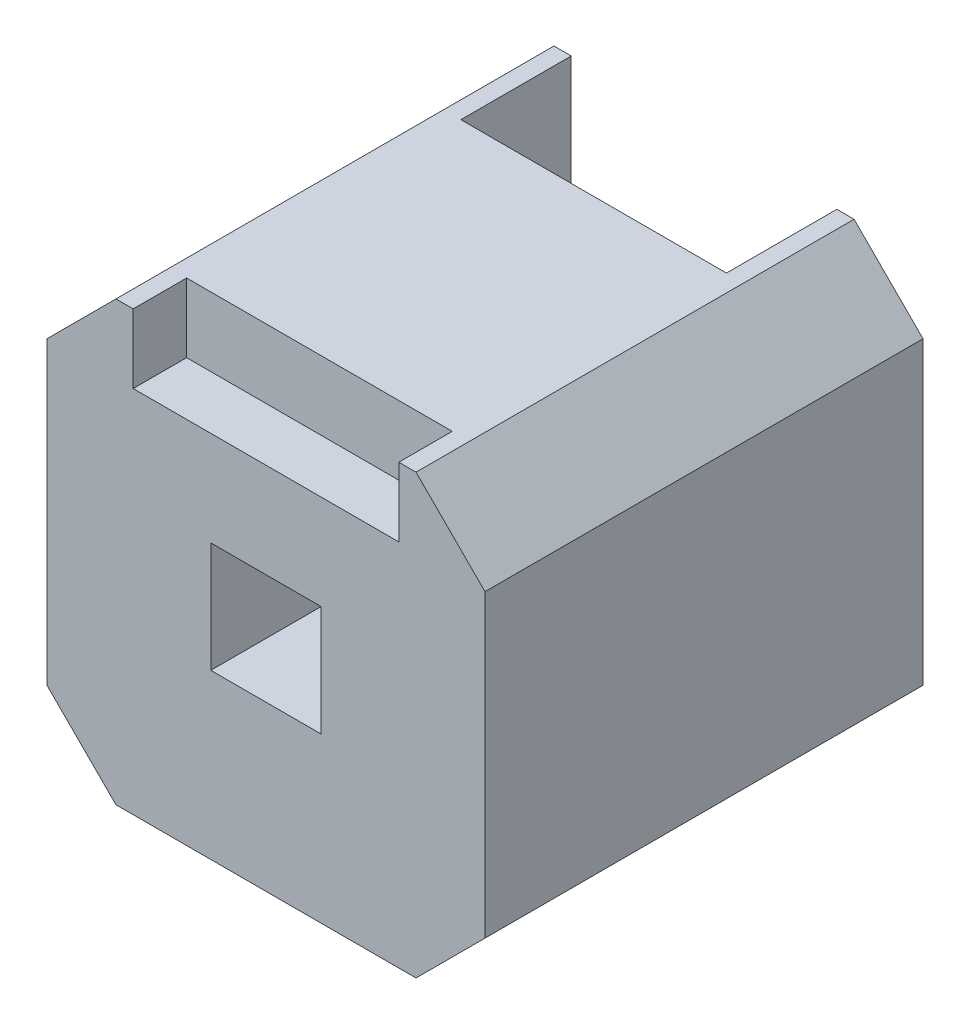
ISO-10303-21;
HEADER;
FILE_DESCRIPTION(('STEP AP214'),'2;1');
FILE_NAME('part.step','',(''),(''),'','','');
FILE_SCHEMA(('AUTOMOTIVE_DESIGN { 1 0 10303 214 1 1 1 1 }'));
ENDSEC;
DATA;
#1=APPLICATION_CONTEXT('core data for automotive mechanical design processes');
#2=APPLICATION_PROTOCOL_DEFINITION('international standard','automotive_design',2000,#1);
#3=PRODUCT_CONTEXT('',#1,'mechanical');
#4=PRODUCT('Part','Part','',(#3));
#5=PRODUCT_RELATED_PRODUCT_CATEGORY('part','',(#4));
#6=PRODUCT_DEFINITION_FORMATION('','',#4);
#7=PRODUCT_DEFINITION_CONTEXT('part definition',#1,'design');
#8=PRODUCT_DEFINITION('design','',#6,#7);
#9=PRODUCT_DEFINITION_SHAPE('','',#8);
#10=(LENGTH_UNIT() NAMED_UNIT(*) SI_UNIT(.MILLI.,.METRE.));
#11=(NAMED_UNIT(*) PLANE_ANGLE_UNIT() SI_UNIT($,.RADIAN.));
#12=(NAMED_UNIT(*) SI_UNIT($,.STERADIAN.) SOLID_ANGLE_UNIT());
#13=UNCERTAINTY_MEASURE_WITH_UNIT(LENGTH_MEASURE(1.E-05),#10,'distance_accuracy_value','');
#14=(GEOMETRIC_REPRESENTATION_CONTEXT(3) GLOBAL_UNCERTAINTY_ASSIGNED_CONTEXT((#13)) GLOBAL_UNIT_ASSIGNED_CONTEXT((#10,
#11,#12)) REPRESENTATION_CONTEXT('',''));
#15=CARTESIAN_POINT('',(0.,0.,0.));
#16=DIRECTION('',(0.,0.,1.));
#17=DIRECTION('',(1.,0.,0.));
#18=AXIS2_PLACEMENT_3D('',#15,#16,#17);
#19=CARTESIAN_POINT('',(0.,1.27,4.20986013986));
#20=DIRECTION('',(0.,1.,0.));
#21=DIRECTION('',(0.,0.,1.));
#22=AXIS2_PLACEMENT_3D('',#19,#20,#21);
#23=PLANE('',#22);
#24=DIRECTION('',(1.,0.,0.));
#25=VECTOR('',#24,1.);
#26=CARTESIAN_POINT('',(0.,1.27,3.6));
#27=LINE('',#26,#25);
#28=CARTESIAN_POINT('',(0.77,1.27,3.6));
#29=VERTEX_POINT('',#28);
#30=CARTESIAN_POINT('',(-0.77,1.27,3.6));
#31=VERTEX_POINT('',#30);
#32=EDGE_CURVE('E260',#29,#31,#27,.F.);
#33=ORIENTED_EDGE('',*,*,#32,.T.);
#34=DIRECTION('',(0.,0.,-1.));
#35=VECTOR('',#34,1.);
#36=CARTESIAN_POINT('',(-0.77,1.27,3.6));
#37=LINE('',#36,#35);
#38=CARTESIAN_POINT('',(-0.77,1.27,2.96));
#39=VERTEX_POINT('',#38);
#40=EDGE_CURVE('E223',#39,#31,#37,.F.);
#41=ORIENTED_EDGE('',*,*,#40,.F.);
#42=DIRECTION('',(1.,0.,0.));
#43=VECTOR('',#42,1.);
#44=CARTESIAN_POINT('',(-0.77,1.27,2.96));
#45=LINE('',#44,#43);
#46=CARTESIAN_POINT('',(-0.87,1.27,2.96));
#47=VERTEX_POINT('',#46);
#48=EDGE_CURVE('E222',#47,#39,#45,.T.);
#49=ORIENTED_EDGE('',*,*,#48,.F.);
#50=DIRECTION('',(0.,0.,1.));
#51=VECTOR('',#50,1.);
#52=CARTESIAN_POINT('',(-0.87,1.27,2.96));
#53=LINE('',#52,#51);
#54=CARTESIAN_POINT('',(-0.87,1.27,5.5));
#55=VERTEX_POINT('',#54);
#56=EDGE_CURVE('E205',#55,#47,#53,.F.);
#57=ORIENTED_EDGE('',*,*,#56,.F.);
#58=DIRECTION('',(1.,0.,0.));
#59=VECTOR('',#58,1.);
#60=CARTESIAN_POINT('',(0.,1.27,5.5));
#61=LINE('',#60,#59);
#62=CARTESIAN_POINT('',(-0.77,1.27,5.5));
#63=VERTEX_POINT('',#62);
#64=EDGE_CURVE('E19',#55,#63,#61,.T.);
#65=ORIENTED_EDGE('',*,*,#64,.T.);
#66=DIRECTION('',(0.,0.,1.));
#67=VECTOR('',#66,1.);
#68=CARTESIAN_POINT('',(-0.77,1.27,4.20986013986));
#69=LINE('',#68,#67);
#70=CARTESIAN_POINT('',(-0.77,1.27,5.19));
#71=VERTEX_POINT('',#70);
#72=EDGE_CURVE('E187',#63,#71,#69,.F.);
#73=ORIENTED_EDGE('',*,*,#72,.T.);
#74=DIRECTION('',(1.,0.,0.));
#75=VECTOR('',#74,1.);
#76=CARTESIAN_POINT('',(0.,1.27,5.19));
#77=LINE('',#76,#75);
#78=CARTESIAN_POINT('',(0.77,1.27,5.19));
#79=VERTEX_POINT('',#78);
#80=EDGE_CURVE('E180',#71,#79,#77,.T.);
#81=ORIENTED_EDGE('',*,*,#80,.T.);
#82=DIRECTION('',(0.,0.,1.));
#83=VECTOR('',#82,1.);
#84=CARTESIAN_POINT('',(0.77,1.27,4.20986013986));
#85=LINE('',#84,#83);
#86=CARTESIAN_POINT('',(0.77,1.27,5.5));
#87=VERTEX_POINT('',#86);
#88=EDGE_CURVE('E265',#79,#87,#85,.T.);
#89=ORIENTED_EDGE('',*,*,#88,.T.);
#90=DIRECTION('',(1.,0.,0.));
#91=VECTOR('',#90,1.);
#92=CARTESIAN_POINT('',(0.,1.27,5.5));
#93=LINE('',#92,#91);
#94=CARTESIAN_POINT('',(0.87,1.27,5.5));
#95=VERTEX_POINT('',#94);
#96=EDGE_CURVE('E263',#87,#95,#93,.T.);
#97=ORIENTED_EDGE('',*,*,#96,.T.);
#98=DIRECTION('',(0.,0.,1.));
#99=VECTOR('',#98,1.);
#100=CARTESIAN_POINT('',(0.87,1.27,5.5));
#101=LINE('',#100,#99);
#102=CARTESIAN_POINT('',(0.87,1.27,2.96));
#103=VERTEX_POINT('',#102);
#104=EDGE_CURVE('E357',#103,#95,#101,.T.);
#105=ORIENTED_EDGE('',*,*,#104,.F.);
#106=DIRECTION('',(1.,0.,0.));
#107=VECTOR('',#106,1.);
#108=CARTESIAN_POINT('',(1.27,1.27,2.96));
#109=LINE('',#108,#107);
#110=CARTESIAN_POINT('',(0.77,1.27,2.96));
#111=VERTEX_POINT('',#110);
#112=EDGE_CURVE('E365',#111,#103,#109,.T.);
#113=ORIENTED_EDGE('',*,*,#112,.F.);
#114=DIRECTION('',(0.,0.,1.));
#115=VECTOR('',#114,1.);
#116=CARTESIAN_POINT('',(0.77,1.27,2.96));
#117=LINE('',#116,#115);
#118=EDGE_CURVE('E254',#29,#111,#117,.F.);
#119=ORIENTED_EDGE('',*,*,#118,.F.);
#120=EDGE_LOOP('',(#33,#41,#49,#57,#65,#73,#81,#89,#97,#105,#113,#119));
#121=FACE_BOUND('',#120,.T.);
#122=ADVANCED_FACE('F16',(#121),#23,.T.);
#123=CARTESIAN_POINT('',(0.77,1.27,2.96));
#124=DIRECTION('',(-1.,0.,0.));
#125=DIRECTION('',(0.,0.,1.));
#126=AXIS2_PLACEMENT_3D('',#123,#124,#125);
#127=PLANE('',#126);
#128=DIRECTION('',(0.,1.,0.));
#129=VECTOR('',#128,1.);
#130=CARTESIAN_POINT('',(0.77,1.27,3.6));
#131=LINE('',#130,#129);
#132=CARTESIAN_POINT('',(0.77,-1.27,3.6));
#133=VERTEX_POINT('',#132);
#134=EDGE_CURVE('E343',#29,#133,#131,.F.);
#135=ORIENTED_EDGE('',*,*,#134,.F.);
#136=ORIENTED_EDGE('',*,*,#118,.T.);
#137=DIRECTION('',(0.,1.,0.));
#138=VECTOR('',#137,1.);
#139=CARTESIAN_POINT('',(0.77,1.27,2.96));
#140=LINE('',#139,#138);
#141=CARTESIAN_POINT('',(0.77,-1.27,2.96));
#142=VERTEX_POINT('',#141);
#143=EDGE_CURVE('E368',#142,#111,#140,.T.);
#144=ORIENTED_EDGE('',*,*,#143,.F.);
#145=DIRECTION('',(0.,0.,1.));
#146=VECTOR('',#145,1.);
#147=CARTESIAN_POINT('',(0.77,-1.27,2.96));
#148=LINE('',#147,#146);
#149=EDGE_CURVE('E257',#142,#133,#148,.T.);
#150=ORIENTED_EDGE('',*,*,#149,.T.);
#151=EDGE_LOOP('',(#135,#136,#144,#150));
#152=FACE_BOUND('',#151,.T.);
#153=ADVANCED_FACE('F430',(#152),#127,.T.);
#154=CARTESIAN_POINT('',(-0.77,1.27,3.6));
#155=DIRECTION('',(1.,0.,0.));
#156=DIRECTION('',(0.,0.,-1.));
#157=AXIS2_PLACEMENT_3D('',#154,#155,#156);
#158=PLANE('',#157);
#159=DIRECTION('',(0.,1.,0.));
#160=VECTOR('',#159,1.);
#161=CARTESIAN_POINT('',(-0.77,1.27,2.96));
#162=LINE('',#161,#160);
#163=CARTESIAN_POINT('',(-0.77,-1.27,2.96));
#164=VERTEX_POINT('',#163);
#165=EDGE_CURVE('E231',#39,#164,#162,.F.);
#166=ORIENTED_EDGE('',*,*,#165,.F.);
#167=ORIENTED_EDGE('',*,*,#40,.T.);
#168=DIRECTION('',(0.,1.,0.));
#169=VECTOR('',#168,1.);
#170=CARTESIAN_POINT('',(-0.77,1.27,3.6));
#171=LINE('',#170,#169);
#172=CARTESIAN_POINT('',(-0.77,-1.27,3.6));
#173=VERTEX_POINT('',#172);
#174=EDGE_CURVE('E339',#173,#31,#171,.T.);
#175=ORIENTED_EDGE('',*,*,#174,.F.);
#176=DIRECTION('',(0.,0.,-1.));
#177=VECTOR('',#176,1.);
#178=CARTESIAN_POINT('',(-0.77,-1.27,3.6));
#179=LINE('',#178,#177);
#180=EDGE_CURVE('E251',#173,#164,#179,.T.);
#181=ORIENTED_EDGE('',*,*,#180,.T.);
#182=EDGE_LOOP('',(#166,#167,#175,#181));
#183=FACE_BOUND('',#182,.T.);
#184=ADVANCED_FACE('F440',(#183),#158,.T.);
#185=CARTESIAN_POINT('',(-0.32,-0.32,0.));
#186=DIRECTION('',(1.,0.,0.));
#187=DIRECTION('',(0.,0.,-1.));
#188=AXIS2_PLACEMENT_3D('',#185,#186,#187);
#189=PLANE('',#188);
#190=DIRECTION('',(0.,0.,1.));
#191=VECTOR('',#190,1.);
#192=CARTESIAN_POINT('',(-0.32,0.32,0.));
#193=LINE('',#192,#191);
#194=CARTESIAN_POINT('',(-0.32,0.32,3.6));
#195=VERTEX_POINT('',#194);
#196=CARTESIAN_POINT('',(-0.32,0.32,5.5));
#197=VERTEX_POINT('',#196);
#198=EDGE_CURVE('E227',#195,#197,#193,.T.);
#199=ORIENTED_EDGE('',*,*,#198,.T.);
#200=DIRECTION('',(0.,1.,0.));
#201=VECTOR('',#200,1.);
#202=CARTESIAN_POINT('',(-0.32,-0.32,5.5));
#203=LINE('',#202,#201);
#204=CARTESIAN_POINT('',(-0.32,-0.32,5.5));
#205=VERTEX_POINT('',#204);
#206=EDGE_CURVE('E220',#197,#205,#203,.F.);
#207=ORIENTED_EDGE('',*,*,#206,.T.);
#208=DIRECTION('',(0.,0.,1.));
#209=VECTOR('',#208,1.);
#210=CARTESIAN_POINT('',(-0.32,-0.32,0.));
#211=LINE('',#210,#209);
#212=CARTESIAN_POINT('',(-0.32,-0.32,3.6));
#213=VERTEX_POINT('',#212);
#214=EDGE_CURVE('E350',#213,#205,#211,.T.);
#215=ORIENTED_EDGE('',*,*,#214,.F.);
#216=DIRECTION('',(0.,1.,0.));
#217=VECTOR('',#216,1.);
#218=CARTESIAN_POINT('',(-0.32,1.27,3.6));
#219=LINE('',#218,#217);
#220=EDGE_CURVE('E335',#195,#213,#219,.F.);
#221=ORIENTED_EDGE('',*,*,#220,.F.);
#222=EDGE_LOOP('',(#199,#207,#215,#221));
#223=FACE_BOUND('',#222,.T.);
#224=ADVANCED_FACE('F551',(#223),#189,.T.);
#225=CARTESIAN_POINT('',(-0.77,1.27,2.96));
#226=DIRECTION('',(0.,0.,-1.));
#227=DIRECTION('',(0.,1.,0.));
#228=AXIS2_PLACEMENT_3D('',#225,#226,#227);
#229=PLANE('',#228);
#230=DIRECTION('',(1.,0.,0.));
#231=VECTOR('',#230,1.);
#232=CARTESIAN_POINT('',(-0.77,-1.27,2.96));
#233=LINE('',#232,#231);
#234=CARTESIAN_POINT('',(-0.87,-1.27,2.96));
#235=VERTEX_POINT('',#234);
#236=EDGE_CURVE('E229',#164,#235,#233,.F.);
#237=ORIENTED_EDGE('',*,*,#236,.T.);
#238=DIRECTION('',(-0.707106781186548,0.707106781186548,0.));
#239=VECTOR('',#238,1.);
#240=CARTESIAN_POINT('',(-1.07,-1.07,2.96));
#241=LINE('',#240,#239);
#242=CARTESIAN_POINT('',(-1.27,-0.87,2.96));
#243=VERTEX_POINT('',#242);
#244=EDGE_CURVE('E218',#235,#243,#241,.T.);
#245=ORIENTED_EDGE('',*,*,#244,.T.);
#246=DIRECTION('',(0.,1.,0.));
#247=VECTOR('',#246,1.);
#248=CARTESIAN_POINT('',(-1.27,1.27,2.96));
#249=LINE('',#248,#247);
#250=CARTESIAN_POINT('',(-1.27,0.87,2.96));
#251=VERTEX_POINT('',#250);
#252=EDGE_CURVE('E226',#251,#243,#249,.F.);
#253=ORIENTED_EDGE('',*,*,#252,.F.);
#254=DIRECTION('',(-0.707106781186548,-0.707106781186548,0.));
#255=VECTOR('',#254,1.);
#256=CARTESIAN_POINT('',(-1.07,1.07,2.96));
#257=LINE('',#256,#255);
#258=EDGE_CURVE('E230',#47,#251,#257,.T.);
#259=ORIENTED_EDGE('',*,*,#258,.F.);
#260=ORIENTED_EDGE('',*,*,#48,.T.);
#261=ORIENTED_EDGE('',*,*,#165,.T.);
#262=EDGE_LOOP('',(#237,#245,#253,#259,#260,#261));
#263=FACE_BOUND('',#262,.T.);
#264=ADVANCED_FACE('F442',(#263),#229,.T.);
#265=CARTESIAN_POINT('',(-1.07,1.07,2.96));
#266=DIRECTION('',(-0.707106781186548,0.707106781186548,0.));
#267=DIRECTION('',(-0.707106781186548,-0.707106781186548,0.));
#268=AXIS2_PLACEMENT_3D('',#265,#266,#267);
#269=PLANE('',#268);
#270=DIRECTION('',(-0.707106781186548,-0.707106781186548,0.));
#271=VECTOR('',#270,1.);
#272=CARTESIAN_POINT('',(-1.07,1.07,5.5));
#273=LINE('',#272,#271);
#274=CARTESIAN_POINT('',(-1.27,0.87,5.5));
#275=VERTEX_POINT('',#274);
#276=EDGE_CURVE('E239',#275,#55,#273,.F.);
#277=ORIENTED_EDGE('',*,*,#276,.T.);
#278=ORIENTED_EDGE('',*,*,#56,.T.);
#279=ORIENTED_EDGE('',*,*,#258,.T.);
#280=DIRECTION('',(0.,0.,1.));
#281=VECTOR('',#280,1.);
#282=CARTESIAN_POINT('',(-1.27,0.87,2.96));
#283=LINE('',#282,#281);
#284=EDGE_CURVE('E314',#275,#251,#283,.F.);
#285=ORIENTED_EDGE('',*,*,#284,.F.);
#286=EDGE_LOOP('',(#277,#278,#279,#285));
#287=FACE_BOUND('',#286,.T.);
#288=ADVANCED_FACE('F384',(#287),#269,.T.);
#289=CARTESIAN_POINT('',(-1.07,-1.07,2.96));
#290=DIRECTION('',(0.707106781186548,0.707106781186548,0.));
#291=DIRECTION('',(-0.707106781186548,0.707106781186548,0.));
#292=AXIS2_PLACEMENT_3D('',#289,#290,#291);
#293=PLANE('',#292);
#294=DIRECTION('',(0.,0.,1.));
#295=VECTOR('',#294,1.);
#296=CARTESIAN_POINT('',(-0.87,-1.27,4.20986013986));
#297=LINE('',#296,#295);
#298=CARTESIAN_POINT('',(-0.87,-1.27,5.5));
#299=VERTEX_POINT('',#298);
#300=EDGE_CURVE('E299',#235,#299,#297,.T.);
#301=ORIENTED_EDGE('',*,*,#300,.T.);
#302=DIRECTION('',(-0.707106781186548,0.707106781186548,0.));
#303=VECTOR('',#302,1.);
#304=CARTESIAN_POINT('',(-1.07,-1.07,5.5));
#305=LINE('',#304,#303);
#306=CARTESIAN_POINT('',(-1.27,-0.87,5.5));
#307=VERTEX_POINT('',#306);
#308=EDGE_CURVE('E377',#307,#299,#305,.F.);
#309=ORIENTED_EDGE('',*,*,#308,.F.);
#310=DIRECTION('',(0.,0.,1.));
#311=VECTOR('',#310,1.);
#312=CARTESIAN_POINT('',(-1.27,-0.87,2.96));
#313=LINE('',#312,#311);
#314=EDGE_CURVE('E318',#243,#307,#313,.T.);
#315=ORIENTED_EDGE('',*,*,#314,.F.);
#316=ORIENTED_EDGE('',*,*,#244,.F.);
#317=EDGE_LOOP('',(#301,#309,#315,#316));
#318=FACE_BOUND('',#317,.T.);
#319=ADVANCED_FACE('F446',(#318),#293,.F.);
#320=CARTESIAN_POINT('',(1.07,-1.07,5.5));
#321=DIRECTION('',(-0.707106781186548,0.707106781186548,0.));
#322=DIRECTION('',(-0.707106781186548,-0.707106781186548,0.));
#323=AXIS2_PLACEMENT_3D('',#320,#321,#322);
#324=PLANE('',#323);
#325=DIRECTION('',(-0.707106781186547,-0.707106781186548,0.));
#326=VECTOR('',#325,1.);
#327=CARTESIAN_POINT('',(1.27,-0.87,2.96));
#328=LINE('',#327,#326);
#329=CARTESIAN_POINT('',(1.27,-0.87,2.96));
#330=VERTEX_POINT('',#329);
#331=CARTESIAN_POINT('',(0.87,-1.27,2.96));
#332=VERTEX_POINT('',#331);
#333=EDGE_CURVE('E217',#330,#332,#328,.T.);
#334=ORIENTED_EDGE('',*,*,#333,.F.);
#335=DIRECTION('',(0.,0.,-1.));
#336=VECTOR('',#335,1.);
#337=CARTESIAN_POINT('',(1.27,-0.87,5.5));
#338=LINE('',#337,#336);
#339=CARTESIAN_POINT('',(1.27,-0.87,5.5));
#340=VERTEX_POINT('',#339);
#341=EDGE_CURVE('E295',#340,#330,#338,.T.);
#342=ORIENTED_EDGE('',*,*,#341,.F.);
#343=DIRECTION('',(-0.707106781186548,-0.707106781186548,0.));
#344=VECTOR('',#343,1.);
#345=CARTESIAN_POINT('',(1.07,-1.07,5.5));
#346=LINE('',#345,#344);
#347=CARTESIAN_POINT('',(0.87,-1.27,5.5));
#348=VERTEX_POINT('',#347);
#349=EDGE_CURVE('E215',#348,#340,#346,.F.);
#350=ORIENTED_EDGE('',*,*,#349,.F.);
#351=DIRECTION('',(0.,0.,1.));
#352=VECTOR('',#351,1.);
#353=CARTESIAN_POINT('',(0.87,-1.27,4.20986013986));
#354=LINE('',#353,#352);
#355=EDGE_CURVE('E311',#348,#332,#354,.F.);
#356=ORIENTED_EDGE('',*,*,#355,.T.);
#357=EDGE_LOOP('',(#334,#342,#350,#356));
#358=FACE_BOUND('',#357,.T.);
#359=ADVANCED_FACE('F450',(#358),#324,.F.);
#360=CARTESIAN_POINT('',(1.27,1.27,2.96));
#361=DIRECTION('',(0.,0.,-1.));
#362=DIRECTION('',(0.,1.,0.));
#363=AXIS2_PLACEMENT_3D('',#360,#361,#362);
#364=PLANE('',#363);
#365=ORIENTED_EDGE('',*,*,#112,.T.);
#366=DIRECTION('',(-0.707106781186548,0.707106781186548,0.));
#367=VECTOR('',#366,1.);
#368=CARTESIAN_POINT('',(1.07,1.07,2.96));
#369=LINE('',#368,#367);
#370=CARTESIAN_POINT('',(1.27,0.87,2.96));
#371=VERTEX_POINT('',#370);
#372=EDGE_CURVE('E361',#371,#103,#369,.T.);
#373=ORIENTED_EDGE('',*,*,#372,.F.);
#374=DIRECTION('',(0.,1.,0.));
#375=VECTOR('',#374,1.);
#376=CARTESIAN_POINT('',(1.27,1.27,2.96));
#377=LINE('',#376,#375);
#378=EDGE_CURVE('E288',#330,#371,#377,.T.);
#379=ORIENTED_EDGE('',*,*,#378,.F.);
#380=ORIENTED_EDGE('',*,*,#333,.T.);
#381=DIRECTION('',(1.,0.,0.));
#382=VECTOR('',#381,1.);
#383=CARTESIAN_POINT('',(0.,-1.27,2.96));
#384=LINE('',#383,#382);
#385=EDGE_CURVE('E307',#332,#142,#384,.F.);
#386=ORIENTED_EDGE('',*,*,#385,.T.);
#387=ORIENTED_EDGE('',*,*,#143,.T.);
#388=EDGE_LOOP('',(#365,#373,#379,#380,#386,#387));
#389=FACE_BOUND('',#388,.T.);
#390=ADVANCED_FACE('F427',(#389),#364,.T.);
#391=CARTESIAN_POINT('',(1.07,1.07,5.5));
#392=DIRECTION('',(0.707106781186548,0.707106781186548,0.));
#393=DIRECTION('',(-0.707106781186548,0.707106781186548,0.));
#394=AXIS2_PLACEMENT_3D('',#391,#392,#393);
#395=PLANE('',#394);
#396=ORIENTED_EDGE('',*,*,#104,.T.);
#397=DIRECTION('',(-0.707106781186548,0.707106781186548,0.));
#398=VECTOR('',#397,1.);
#399=CARTESIAN_POINT('',(1.07,1.07,5.5));
#400=LINE('',#399,#398);
#401=CARTESIAN_POINT('',(1.27,0.87,5.5));
#402=VERTEX_POINT('',#401);
#403=EDGE_CURVE('E355',#95,#402,#400,.F.);
#404=ORIENTED_EDGE('',*,*,#403,.T.);
#405=DIRECTION('',(0.,0.,-1.));
#406=VECTOR('',#405,1.);
#407=CARTESIAN_POINT('',(1.27,0.87,5.5));
#408=LINE('',#407,#406);
#409=EDGE_CURVE('E283',#371,#402,#408,.F.);
#410=ORIENTED_EDGE('',*,*,#409,.F.);
#411=ORIENTED_EDGE('',*,*,#372,.T.);
#412=EDGE_LOOP('',(#396,#404,#410,#411));
#413=FACE_BOUND('',#412,.T.);
#414=ADVANCED_FACE('F421',(#413),#395,.T.);
#415=CARTESIAN_POINT('',(-0.77,0.87,5.19));
#416=DIRECTION('',(0.,0.,1.));
#417=DIRECTION('',(1.,0.,0.));
#418=AXIS2_PLACEMENT_3D('',#415,#416,#417);
#419=PLANE('',#418);
#420=DIRECTION('',(0.,1.,0.));
#421=VECTOR('',#420,1.);
#422=CARTESIAN_POINT('',(0.77,0.87,5.19));
#423=LINE('',#422,#421);
#424=CARTESIAN_POINT('',(0.77,0.87,5.19));
#425=VERTEX_POINT('',#424);
#426=EDGE_CURVE('E275',#425,#79,#423,.T.);
#427=ORIENTED_EDGE('',*,*,#426,.T.);
#428=ORIENTED_EDGE('',*,*,#80,.F.);
#429=DIRECTION('',(0.,1.,0.));
#430=VECTOR('',#429,1.);
#431=CARTESIAN_POINT('',(-0.77,0.87,5.19));
#432=LINE('',#431,#430);
#433=CARTESIAN_POINT('',(-0.77,0.87,5.19));
#434=VERTEX_POINT('',#433);
#435=EDGE_CURVE('E192',#71,#434,#432,.F.);
#436=ORIENTED_EDGE('',*,*,#435,.T.);
#437=DIRECTION('',(1.,0.,0.));
#438=VECTOR('',#437,1.);
#439=CARTESIAN_POINT('',(-0.77,0.87,5.19));
#440=LINE('',#439,#438);
#441=EDGE_CURVE('E280',#425,#434,#440,.F.);
#442=ORIENTED_EDGE('',*,*,#441,.F.);
#443=EDGE_LOOP('',(#427,#428,#436,#442));
#444=FACE_BOUND('',#443,.T.);
#445=ADVANCED_FACE('F278',(#444),#419,.T.);
#446=CARTESIAN_POINT('',(-0.32,-0.32,0.));
#447=DIRECTION('',(0.,1.,0.));
#448=DIRECTION('',(0.,0.,1.));
#449=AXIS2_PLACEMENT_3D('',#446,#447,#448);
#450=PLANE('',#449);
#451=ORIENTED_EDGE('',*,*,#214,.T.);
#452=DIRECTION('',(1.,0.,0.));
#453=VECTOR('',#452,1.);
#454=CARTESIAN_POINT('',(-0.32,-0.32,5.5));
#455=LINE('',#454,#453);
#456=CARTESIAN_POINT('',(0.32,-0.32,5.5));
#457=VERTEX_POINT('',#456);
#458=EDGE_CURVE('E347',#205,#457,#455,.T.);
#459=ORIENTED_EDGE('',*,*,#458,.T.);
#460=DIRECTION('',(0.,0.,-1.));
#461=VECTOR('',#460,1.);
#462=CARTESIAN_POINT('',(0.32,-0.32,0.));
#463=LINE('',#462,#461);
#464=CARTESIAN_POINT('',(0.32,-0.32,3.6));
#465=VERTEX_POINT('',#464);
#466=EDGE_CURVE('E402',#457,#465,#463,.T.);
#467=ORIENTED_EDGE('',*,*,#466,.T.);
#468=DIRECTION('',(1.,0.,0.));
#469=VECTOR('',#468,1.);
#470=CARTESIAN_POINT('',(0.77,-0.32,3.6));
#471=LINE('',#470,#469);
#472=EDGE_CURVE('E332',#213,#465,#471,.T.);
#473=ORIENTED_EDGE('',*,*,#472,.F.);
#474=EDGE_LOOP('',(#451,#459,#467,#473));
#475=FACE_BOUND('',#474,.T.);
#476=ADVANCED_FACE('F487',(#475),#450,.T.);
#477=CARTESIAN_POINT('',(0.77,1.27,3.6));
#478=DIRECTION('',(0.,0.,-1.));
#479=DIRECTION('',(0.,1.,0.));
#480=AXIS2_PLACEMENT_3D('',#477,#478,#479);
#481=PLANE('',#480);
#482=ORIENTED_EDGE('',*,*,#472,.T.);
#483=DIRECTION('',(0.,1.,0.));
#484=VECTOR('',#483,1.);
#485=CARTESIAN_POINT('',(0.32,-0.32,3.6));
#486=LINE('',#485,#484);
#487=CARTESIAN_POINT('',(0.32,0.32,3.6));
#488=VERTEX_POINT('',#487);
#489=EDGE_CURVE('E396',#465,#488,#486,.T.);
#490=ORIENTED_EDGE('',*,*,#489,.T.);
#491=DIRECTION('',(1.,0.,0.));
#492=VECTOR('',#491,1.);
#493=CARTESIAN_POINT('',(-0.32,0.32,3.6));
#494=LINE('',#493,#492);
#495=EDGE_CURVE('E328',#488,#195,#494,.F.);
#496=ORIENTED_EDGE('',*,*,#495,.T.);
#497=ORIENTED_EDGE('',*,*,#220,.T.);
#498=EDGE_LOOP('',(#482,#490,#496,#497));
#499=FACE_BOUND('',#498,.T.);
#500=ORIENTED_EDGE('',*,*,#174,.T.);
#501=ORIENTED_EDGE('',*,*,#32,.F.);
#502=ORIENTED_EDGE('',*,*,#134,.T.);
#503=DIRECTION('',(1.,0.,0.));
#504=VECTOR('',#503,1.);
#505=CARTESIAN_POINT('',(0.,-1.27,3.6));
#506=LINE('',#505,#504);
#507=EDGE_CURVE('E303',#133,#173,#506,.F.);
#508=ORIENTED_EDGE('',*,*,#507,.T.);
#509=EDGE_LOOP('',(#500,#501,#502,#508));
#510=FACE_BOUND('',#509,.T.);
#511=ADVANCED_FACE('F433',(#499,#510),#481,.T.);
#512=CARTESIAN_POINT('',(-0.32,0.32,0.));
#513=DIRECTION('',(0.,1.,0.));
#514=DIRECTION('',(0.,0.,1.));
#515=AXIS2_PLACEMENT_3D('',#512,#513,#514);
#516=PLANE('',#515);
#517=ORIENTED_EDGE('',*,*,#198,.F.);
#518=ORIENTED_EDGE('',*,*,#495,.F.);
#519=DIRECTION('',(0.,0.,-1.));
#520=VECTOR('',#519,1.);
#521=CARTESIAN_POINT('',(0.32,0.32,0.));
#522=LINE('',#521,#520);
#523=CARTESIAN_POINT('',(0.32,0.32,5.5));
#524=VERTEX_POINT('',#523);
#525=EDGE_CURVE('E391',#488,#524,#522,.F.);
#526=ORIENTED_EDGE('',*,*,#525,.T.);
#527=DIRECTION('',(1.,0.,0.));
#528=VECTOR('',#527,1.);
#529=CARTESIAN_POINT('',(-0.32,0.32,5.5));
#530=LINE('',#529,#528);
#531=EDGE_CURVE('E34',#197,#524,#530,.T.);
#532=ORIENTED_EDGE('',*,*,#531,.F.);
#533=EDGE_LOOP('',(#517,#518,#526,#532));
#534=FACE_BOUND('',#533,.T.);
#535=ADVANCED_FACE('F481',(#534),#516,.F.);
#536=CARTESIAN_POINT('',(-1.27,1.27,2.96));
#537=DIRECTION('',(-1.,0.,0.));
#538=DIRECTION('',(0.,0.,1.));
#539=AXIS2_PLACEMENT_3D('',#536,#537,#538);
#540=PLANE('',#539);
#541=DIRECTION('',(0.,-1.,0.));
#542=VECTOR('',#541,1.);
#543=CARTESIAN_POINT('',(-1.27,1.27,5.5));
#544=LINE('',#543,#542);
#545=EDGE_CURVE('E387',#275,#307,#544,.T.);
#546=ORIENTED_EDGE('',*,*,#545,.F.);
#547=ORIENTED_EDGE('',*,*,#284,.T.);
#548=ORIENTED_EDGE('',*,*,#252,.T.);
#549=ORIENTED_EDGE('',*,*,#314,.T.);
#550=EDGE_LOOP('',(#546,#547,#548,#549));
#551=FACE_BOUND('',#550,.T.);
#552=ADVANCED_FACE('F443',(#551),#540,.T.);
#553=CARTESIAN_POINT('',(0.,-1.27,4.20986013986));
#554=DIRECTION('',(0.,1.,0.));
#555=DIRECTION('',(0.,0.,1.));
#556=AXIS2_PLACEMENT_3D('',#553,#554,#555);
#557=PLANE('',#556);
#558=ORIENTED_EDGE('',*,*,#236,.F.);
#559=ORIENTED_EDGE('',*,*,#180,.F.);
#560=ORIENTED_EDGE('',*,*,#507,.F.);
#561=ORIENTED_EDGE('',*,*,#149,.F.);
#562=ORIENTED_EDGE('',*,*,#385,.F.);
#563=ORIENTED_EDGE('',*,*,#355,.F.);
#564=DIRECTION('',(1.,0.,0.));
#565=VECTOR('',#564,1.);
#566=CARTESIAN_POINT('',(-1.27,-1.27,5.5));
#567=LINE('',#566,#565);
#568=EDGE_CURVE('E213',#299,#348,#567,.T.);
#569=ORIENTED_EDGE('',*,*,#568,.F.);
#570=ORIENTED_EDGE('',*,*,#300,.F.);
#571=EDGE_LOOP('',(#558,#559,#560,#561,#562,#563,#569,#570));
#572=FACE_BOUND('',#571,.T.);
#573=ADVANCED_FACE('F435',(#572),#557,.F.);
#574=CARTESIAN_POINT('',(1.27,1.27,5.5));
#575=DIRECTION('',(1.,0.,0.));
#576=DIRECTION('',(0.,0.,-1.));
#577=AXIS2_PLACEMENT_3D('',#574,#575,#576);
#578=PLANE('',#577);
#579=ORIENTED_EDGE('',*,*,#378,.T.);
#580=ORIENTED_EDGE('',*,*,#409,.T.);
#581=DIRECTION('',(0.,-1.,0.));
#582=VECTOR('',#581,1.);
#583=CARTESIAN_POINT('',(1.27,1.27,5.5));
#584=LINE('',#583,#582);
#585=EDGE_CURVE('E393',#340,#402,#584,.F.);
#586=ORIENTED_EDGE('',*,*,#585,.F.);
#587=ORIENTED_EDGE('',*,*,#341,.T.);
#588=EDGE_LOOP('',(#579,#580,#586,#587));
#589=FACE_BOUND('',#588,.T.);
#590=ADVANCED_FACE('F417',(#589),#578,.T.);
#591=CARTESIAN_POINT('',(0.77,0.87,5.19));
#592=DIRECTION('',(1.,0.,0.));
#593=DIRECTION('',(0.,0.,-1.));
#594=AXIS2_PLACEMENT_3D('',#591,#592,#593);
#595=PLANE('',#594);
#596=ORIENTED_EDGE('',*,*,#88,.F.);
#597=ORIENTED_EDGE('',*,*,#426,.F.);
#598=DIRECTION('',(0.,0.,1.));
#599=VECTOR('',#598,1.);
#600=CARTESIAN_POINT('',(0.77,0.87,5.19));
#601=LINE('',#600,#599);
#602=CARTESIAN_POINT('',(0.77,0.87,5.5));
#603=VERTEX_POINT('',#602);
#604=EDGE_CURVE('E282',#603,#425,#601,.F.);
#605=ORIENTED_EDGE('',*,*,#604,.F.);
#606=DIRECTION('',(0.,-1.,0.));
#607=VECTOR('',#606,1.);
#608=CARTESIAN_POINT('',(0.77,1.27,5.5));
#609=LINE('',#608,#607);
#610=EDGE_CURVE('E277',#87,#603,#609,.T.);
#611=ORIENTED_EDGE('',*,*,#610,.F.);
#612=EDGE_LOOP('',(#596,#597,#605,#611));
#613=FACE_BOUND('',#612,.T.);
#614=ADVANCED_FACE('F274',(#613),#595,.F.);
#615=CARTESIAN_POINT('',(-0.77,0.87,5.19));
#616=DIRECTION('',(0.,1.,0.));
#617=DIRECTION('',(0.,0.,1.));
#618=AXIS2_PLACEMENT_3D('',#615,#616,#617);
#619=PLANE('',#618);
#620=DIRECTION('',(0.,0.,-1.));
#621=VECTOR('',#620,1.);
#622=CARTESIAN_POINT('',(-0.77,0.87,5.19));
#623=LINE('',#622,#621);
#624=CARTESIAN_POINT('',(-0.77,0.87,5.5));
#625=VERTEX_POINT('',#624);
#626=EDGE_CURVE('E405',#625,#434,#623,.T.);
#627=ORIENTED_EDGE('',*,*,#626,.F.);
#628=DIRECTION('',(1.,0.,0.));
#629=VECTOR('',#628,1.);
#630=CARTESIAN_POINT('',(-1.27,0.87,5.5));
#631=LINE('',#630,#629);
#632=EDGE_CURVE('E201',#603,#625,#631,.F.);
#633=ORIENTED_EDGE('',*,*,#632,.F.);
#634=ORIENTED_EDGE('',*,*,#604,.T.);
#635=ORIENTED_EDGE('',*,*,#441,.T.);
#636=EDGE_LOOP('',(#627,#633,#634,#635));
#637=FACE_BOUND('',#636,.T.);
#638=ADVANCED_FACE('F409',(#637),#619,.T.);
#639=CARTESIAN_POINT('',(-0.77,0.87,5.19));
#640=DIRECTION('',(1.,0.,0.));
#641=DIRECTION('',(0.,0.,-1.));
#642=AXIS2_PLACEMENT_3D('',#639,#640,#641);
#643=PLANE('',#642);
#644=ORIENTED_EDGE('',*,*,#72,.F.);
#645=DIRECTION('',(0.,-1.,0.));
#646=VECTOR('',#645,1.);
#647=CARTESIAN_POINT('',(-0.77,1.27,5.5));
#648=LINE('',#647,#646);
#649=EDGE_CURVE('E26',#625,#63,#648,.F.);
#650=ORIENTED_EDGE('',*,*,#649,.F.);
#651=ORIENTED_EDGE('',*,*,#626,.T.);
#652=ORIENTED_EDGE('',*,*,#435,.F.);
#653=EDGE_LOOP('',(#644,#650,#651,#652));
#654=FACE_BOUND('',#653,.T.);
#655=ADVANCED_FACE('F189',(#654),#643,.T.);
#656=CARTESIAN_POINT('',(0.32,-0.32,0.));
#657=DIRECTION('',(1.,0.,0.));
#658=DIRECTION('',(0.,0.,-1.));
#659=AXIS2_PLACEMENT_3D('',#656,#657,#658);
#660=PLANE('',#659);
#661=ORIENTED_EDGE('',*,*,#525,.F.);
#662=ORIENTED_EDGE('',*,*,#489,.F.);
#663=ORIENTED_EDGE('',*,*,#466,.F.);
#664=DIRECTION('',(0.,-1.,0.));
#665=VECTOR('',#664,1.);
#666=CARTESIAN_POINT('',(0.32,1.27,5.5));
#667=LINE('',#666,#665);
#668=EDGE_CURVE('E11',#524,#457,#667,.T.);
#669=ORIENTED_EDGE('',*,*,#668,.F.);
#670=EDGE_LOOP('',(#661,#662,#663,#669));
#671=FACE_BOUND('',#670,.T.);
#672=ADVANCED_FACE('F461',(#671),#660,.F.);
#673=CARTESIAN_POINT('',(-1.27,1.27,5.5));
#674=DIRECTION('',(0.,0.,1.));
#675=DIRECTION('',(0.,-1.,0.));
#676=AXIS2_PLACEMENT_3D('',#673,#674,#675);
#677=PLANE('',#676);
#678=ORIENTED_EDGE('',*,*,#531,.T.);
#679=ORIENTED_EDGE('',*,*,#668,.T.);
#680=ORIENTED_EDGE('',*,*,#458,.F.);
#681=ORIENTED_EDGE('',*,*,#206,.F.);
#682=EDGE_LOOP('',(#678,#679,#680,#681));
#683=FACE_BOUND('',#682,.T.);
#684=ORIENTED_EDGE('',*,*,#64,.F.);
#685=ORIENTED_EDGE('',*,*,#276,.F.);
#686=ORIENTED_EDGE('',*,*,#545,.T.);
#687=ORIENTED_EDGE('',*,*,#308,.T.);
#688=ORIENTED_EDGE('',*,*,#568,.T.);
#689=ORIENTED_EDGE('',*,*,#349,.T.);
#690=ORIENTED_EDGE('',*,*,#585,.T.);
#691=ORIENTED_EDGE('',*,*,#403,.F.);
#692=ORIENTED_EDGE('',*,*,#96,.F.);
#693=ORIENTED_EDGE('',*,*,#610,.T.);
#694=ORIENTED_EDGE('',*,*,#632,.T.);
#695=ORIENTED_EDGE('',*,*,#649,.T.);
#696=EDGE_LOOP('',(#684,#685,#686,#687,#688,#689,#690,#691,#692,#693,#694,#695));
#697=FACE_BOUND('',#696,.T.);
#698=ADVANCED_FACE('F197',(#683,#697),#677,.T.);
#699=CLOSED_SHELL('',(#122,#153,#184,#224,#264,#288,#319,#359,#390,#414,#445,#476,#511,#535,
#552,#573,#590,#614,#638,#655,#672,#698));
#700=MANIFOLD_SOLID_BREP('B1',#699);
#701=ADVANCED_BREP_SHAPE_REPRESENTATION('',(#18,#700),#14);
#702=SHAPE_DEFINITION_REPRESENTATION(#9,#701);
ENDSEC;
END-ISO-10303-21;
